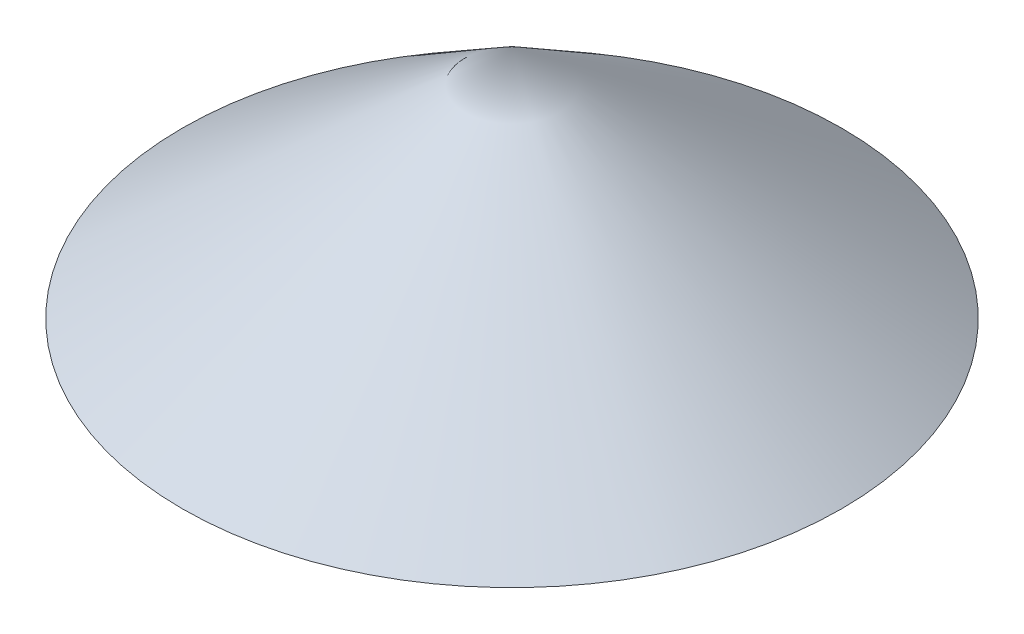
ISO-10303-21;
HEADER;
FILE_DESCRIPTION(('STEP AP214'),'2;1');
FILE_NAME('part.step','',(''),(''),'','','');
FILE_SCHEMA(('AUTOMOTIVE_DESIGN { 1 0 10303 214 1 1 1 1 }'));
ENDSEC;
DATA;
#1=APPLICATION_CONTEXT('core data for automotive mechanical design processes');
#2=APPLICATION_PROTOCOL_DEFINITION('international standard','automotive_design',2000,#1);
#3=PRODUCT_CONTEXT('',#1,'mechanical');
#4=PRODUCT('Part','Part','',(#3));
#5=PRODUCT_RELATED_PRODUCT_CATEGORY('part','',(#4));
#6=PRODUCT_DEFINITION_FORMATION('','',#4);
#7=PRODUCT_DEFINITION_CONTEXT('part definition',#1,'design');
#8=PRODUCT_DEFINITION('design','',#6,#7);
#9=PRODUCT_DEFINITION_SHAPE('','',#8);
#10=(LENGTH_UNIT() NAMED_UNIT(*) SI_UNIT(.MILLI.,.METRE.));
#11=(NAMED_UNIT(*) PLANE_ANGLE_UNIT() SI_UNIT($,.RADIAN.));
#12=(NAMED_UNIT(*) SI_UNIT($,.STERADIAN.) SOLID_ANGLE_UNIT());
#13=UNCERTAINTY_MEASURE_WITH_UNIT(LENGTH_MEASURE(1.E-05),#10,'distance_accuracy_value','');
#14=(GEOMETRIC_REPRESENTATION_CONTEXT(3) GLOBAL_UNCERTAINTY_ASSIGNED_CONTEXT((#13)) GLOBAL_UNIT_ASSIGNED_CONTEXT((#10,
#11,#12)) REPRESENTATION_CONTEXT('',''));
#15=CARTESIAN_POINT('',(0.,0.,0.));
#16=DIRECTION('',(0.,0.,1.));
#17=DIRECTION('',(1.,0.,0.));
#18=AXIS2_PLACEMENT_3D('',#15,#16,#17);
#19=CARTESIAN_POINT('',(0.,0.,0.));
#20=DIRECTION('',(0.,-1.,0.));
#21=DIRECTION('',(0.,0.,-1.));
#22=AXIS2_PLACEMENT_3D('',#19,#20,#21);
#23=PLANE('',#22);
#24=CARTESIAN_POINT('',(0.,0.,0.));
#25=DIRECTION('',(0.,-1.,0.));
#26=DIRECTION('',(0.,0.,-1.));
#27=AXIS2_PLACEMENT_3D('',#24,#25,#26);
#28=CIRCLE('',#27,354.965);
#29=CARTESIAN_POINT('',(0.,0.,-354.965));
#30=VERTEX_POINT('',#29);
#31=EDGE_CURVE('E40',#30,#30,#28,.T.);
#32=ORIENTED_EDGE('',*,*,#31,.F.);
#33=EDGE_LOOP('',(#32));
#34=FACE_BOUND('',#33,.T.);
#35=CARTESIAN_POINT('',(0.,0.,0.));
#36=DIRECTION('',(0.,-1.,0.));
#37=DIRECTION('',(0.,0.,-1.));
#38=AXIS2_PLACEMENT_3D('',#35,#36,#37);
#39=CIRCLE('',#38,355.6);
#40=CARTESIAN_POINT('',(0.,0.,-355.6));
#41=VERTEX_POINT('',#40);
#42=EDGE_CURVE('E11',#41,#41,#39,.T.);
#43=ORIENTED_EDGE('',*,*,#42,.T.);
#44=EDGE_LOOP('',(#43));
#45=FACE_BOUND('',#44,.T.);
#46=ADVANCED_FACE('F33',(#34,#45),#23,.T.);
#47=CARTESIAN_POINT('',(0.,0.,0.));
#48=DIRECTION('',(0.,-1.,0.));
#49=DIRECTION('',(0.,0.,-1.));
#50=AXIS2_PLACEMENT_3D('',#47,#48,#49);
#51=CONICAL_SURFACE('',#50,355.6,0.950546840812075);
#52=CARTESIAN_POINT('',(0.,254.,0.));
#53=VERTEX_POINT('',#52);
#54=VERTEX_LOOP('',#53);
#55=FACE_BOUND('',#54,.T.);
#56=ORIENTED_EDGE('',*,*,#42,.F.);
#57=EDGE_LOOP('',(#56));
#58=FACE_BOUND('',#57,.T.);
#59=ADVANCED_FACE('F49',(#55,#58),#51,.T.);
#60=CARTESIAN_POINT('',(0.,0.,0.));
#61=DIRECTION('',(0.,-1.,0.));
#62=DIRECTION('',(0.,0.,-1.));
#63=AXIS2_PLACEMENT_3D('',#60,#61,#62);
#64=CONICAL_SURFACE('',#63,354.965,0.95088536483435);
#65=CARTESIAN_POINT('',(0.,253.365,0.));
#66=VERTEX_POINT('',#65);
#67=VERTEX_LOOP('',#66);
#68=FACE_BOUND('',#67,.T.);
#69=ORIENTED_EDGE('',*,*,#31,.T.);
#70=EDGE_LOOP('',(#69));
#71=FACE_BOUND('',#70,.T.);
#72=ADVANCED_FACE('F46',(#68,#71),#64,.F.);
#73=CLOSED_SHELL('',(#46,#59,#72));
#74=MANIFOLD_SOLID_BREP('B2',#73);
#75=ADVANCED_BREP_SHAPE_REPRESENTATION('',(#18,#74),#14);
#76=SHAPE_DEFINITION_REPRESENTATION(#9,#75);
ENDSEC;
END-ISO-10303-21;
